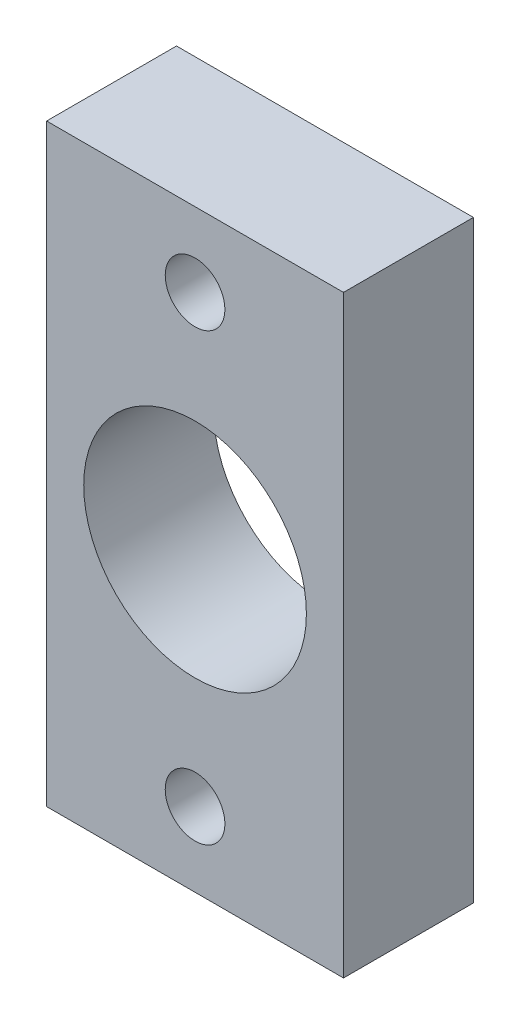
ISO-10303-21;
HEADER;
FILE_DESCRIPTION(('STEP AP214'),'2;1');
FILE_NAME('part.step','',(''),(''),'','','');
FILE_SCHEMA(('AUTOMOTIVE_DESIGN { 1 0 10303 214 1 1 1 1 }'));
ENDSEC;
DATA;
#1=APPLICATION_CONTEXT('core data for automotive mechanical design processes');
#2=APPLICATION_PROTOCOL_DEFINITION('international standard','automotive_design',2000,#1);
#3=PRODUCT_CONTEXT('',#1,'mechanical');
#4=PRODUCT('Part','Part','',(#3));
#5=PRODUCT_RELATED_PRODUCT_CATEGORY('part','',(#4));
#6=PRODUCT_DEFINITION_FORMATION('','',#4);
#7=PRODUCT_DEFINITION_CONTEXT('part definition',#1,'design');
#8=PRODUCT_DEFINITION('design','',#6,#7);
#9=PRODUCT_DEFINITION_SHAPE('','',#8);
#10=(LENGTH_UNIT() NAMED_UNIT(*) SI_UNIT(.MILLI.,.METRE.));
#11=(NAMED_UNIT(*) PLANE_ANGLE_UNIT() SI_UNIT($,.RADIAN.));
#12=(NAMED_UNIT(*) SI_UNIT($,.STERADIAN.) SOLID_ANGLE_UNIT());
#13=UNCERTAINTY_MEASURE_WITH_UNIT(LENGTH_MEASURE(1.E-05),#10,'distance_accuracy_value','');
#14=(GEOMETRIC_REPRESENTATION_CONTEXT(3) GLOBAL_UNCERTAINTY_ASSIGNED_CONTEXT((#13)) GLOBAL_UNIT_ASSIGNED_CONTEXT((#10,
#11,#12)) REPRESENTATION_CONTEXT('',''));
#15=CARTESIAN_POINT('',(0.,0.,0.));
#16=DIRECTION('',(0.,0.,1.));
#17=DIRECTION('',(1.,0.,0.));
#18=AXIS2_PLACEMENT_3D('',#15,#16,#17);
#19=CARTESIAN_POINT('',(0.,0.,-0.555625));
#20=DIRECTION('',(0.,0.,-1.));
#21=DIRECTION('',(1.,0.,0.));
#22=AXIS2_PLACEMENT_3D('',#19,#20,#21);
#23=CYLINDRICAL_SURFACE('',#22,9.525);
#24=CARTESIAN_POINT('',(0.,0.,5.55625));
#25=DIRECTION('',(0.,0.,-1.));
#26=DIRECTION('',(1.,0.,0.));
#27=AXIS2_PLACEMENT_3D('',#24,#25,#26);
#28=CIRCLE('',#27,9.525);
#29=CARTESIAN_POINT('',(9.525,0.,5.55625));
#30=VERTEX_POINT('',#29);
#31=CARTESIAN_POINT('',(-9.525,0.,5.55625));
#32=VERTEX_POINT('',#31);
#33=EDGE_CURVE('E39',#30,#32,#28,.T.);
#34=ORIENTED_EDGE('',*,*,#33,.F.);
#35=CARTESIAN_POINT('',(0.,0.,5.55625));
#36=DIRECTION('',(0.,0.,-1.));
#37=DIRECTION('',(1.,0.,0.));
#38=AXIS2_PLACEMENT_3D('',#35,#36,#37);
#39=CIRCLE('',#38,9.525);
#40=EDGE_CURVE('E44',#32,#30,#39,.T.);
#41=ORIENTED_EDGE('',*,*,#40,.F.);
#42=DIRECTION('',(0.,0.,-1.));
#43=VECTOR('',#42,1.);
#44=CARTESIAN_POINT('',(-9.525,0.,-0.555625));
#45=LINE('',#44,#43);
#46=CARTESIAN_POINT('',(-9.525,0.,-5.55625));
#47=VERTEX_POINT('',#46);
#48=EDGE_CURVE('E11',#32,#47,#45,.T.);
#49=ORIENTED_EDGE('',*,*,#48,.T.);
#50=CARTESIAN_POINT('',(0.,0.,-5.55625));
#51=DIRECTION('',(0.,0.,1.));
#52=DIRECTION('',(1.,0.,0.));
#53=AXIS2_PLACEMENT_3D('',#50,#51,#52);
#54=CIRCLE('',#53,9.525);
#55=EDGE_CURVE('E119',#47,#47,#54,.T.);
#56=ORIENTED_EDGE('',*,*,#55,.F.);
#57=ORIENTED_EDGE('',*,*,#48,.F.);
#58=EDGE_LOOP('',(#34,#41,#49,#56,#57));
#59=FACE_BOUND('',#58,.T.);
#60=ADVANCED_FACE('F16',(#59),#23,.F.);
#61=CARTESIAN_POINT('',(0.,-19.05,-0.555625));
#62=DIRECTION('',(0.,0.,-1.));
#63=DIRECTION('',(1.,0.,0.));
#64=AXIS2_PLACEMENT_3D('',#61,#62,#63);
#65=CYLINDRICAL_SURFACE('',#64,2.5525);
#66=CARTESIAN_POINT('',(0.,-19.05,5.55625));
#67=DIRECTION('',(0.,0.,-1.));
#68=DIRECTION('',(1.,0.,0.));
#69=AXIS2_PLACEMENT_3D('',#66,#67,#68);
#70=CIRCLE('',#69,2.5525);
#71=CARTESIAN_POINT('',(2.5525,-19.05,5.55625));
#72=VERTEX_POINT('',#71);
#73=CARTESIAN_POINT('',(-2.5525,-19.05,5.55625));
#74=VERTEX_POINT('',#73);
#75=EDGE_CURVE('E173',#72,#74,#70,.T.);
#76=ORIENTED_EDGE('',*,*,#75,.F.);
#77=CARTESIAN_POINT('',(0.,-19.05,5.55625));
#78=DIRECTION('',(0.,0.,-1.));
#79=DIRECTION('',(1.,0.,0.));
#80=AXIS2_PLACEMENT_3D('',#77,#78,#79);
#81=CIRCLE('',#80,2.5525);
#82=EDGE_CURVE('E167',#74,#72,#81,.T.);
#83=ORIENTED_EDGE('',*,*,#82,.F.);
#84=DIRECTION('',(0.,0.,-1.));
#85=VECTOR('',#84,1.);
#86=CARTESIAN_POINT('',(-2.5525,-19.05,-0.555625));
#87=LINE('',#86,#85);
#88=CARTESIAN_POINT('',(-2.5525,-19.05,-5.55625));
#89=VERTEX_POINT('',#88);
#90=EDGE_CURVE('E26',#74,#89,#87,.T.);
#91=ORIENTED_EDGE('',*,*,#90,.T.);
#92=CARTESIAN_POINT('',(0.,-19.05,-5.55625));
#93=DIRECTION('',(0.,0.,1.));
#94=DIRECTION('',(1.,0.,0.));
#95=AXIS2_PLACEMENT_3D('',#92,#93,#94);
#96=CIRCLE('',#95,2.5525);
#97=EDGE_CURVE('E153',#89,#89,#96,.T.);
#98=ORIENTED_EDGE('',*,*,#97,.F.);
#99=ORIENTED_EDGE('',*,*,#90,.F.);
#100=EDGE_LOOP('',(#76,#83,#91,#98,#99));
#101=FACE_BOUND('',#100,.T.);
#102=ADVANCED_FACE('F205',(#101),#65,.F.);
#103=CARTESIAN_POINT('',(0.,19.05,-0.555625));
#104=DIRECTION('',(0.,0.,-1.));
#105=DIRECTION('',(1.,0.,0.));
#106=AXIS2_PLACEMENT_3D('',#103,#104,#105);
#107=CYLINDRICAL_SURFACE('',#106,2.5525);
#108=CARTESIAN_POINT('',(0.,19.05,5.55625));
#109=DIRECTION('',(0.,0.,-1.));
#110=DIRECTION('',(1.,0.,0.));
#111=AXIS2_PLACEMENT_3D('',#108,#109,#110);
#112=CIRCLE('',#111,2.5525);
#113=CARTESIAN_POINT('',(2.5525,19.05,5.55625));
#114=VERTEX_POINT('',#113);
#115=CARTESIAN_POINT('',(-2.5525,19.05,5.55625));
#116=VERTEX_POINT('',#115);
#117=EDGE_CURVE('E142',#114,#116,#112,.T.);
#118=ORIENTED_EDGE('',*,*,#117,.F.);
#119=CARTESIAN_POINT('',(0.,19.05,5.55625));
#120=DIRECTION('',(0.,0.,-1.));
#121=DIRECTION('',(1.,0.,0.));
#122=AXIS2_PLACEMENT_3D('',#119,#120,#121);
#123=CIRCLE('',#122,2.5525);
#124=EDGE_CURVE('E136',#116,#114,#123,.T.);
#125=ORIENTED_EDGE('',*,*,#124,.F.);
#126=DIRECTION('',(0.,0.,-1.));
#127=VECTOR('',#126,1.);
#128=CARTESIAN_POINT('',(-2.5525,19.05,-0.555625));
#129=LINE('',#128,#127);
#130=CARTESIAN_POINT('',(-2.5525,19.05,-5.55625));
#131=VERTEX_POINT('',#130);
#132=EDGE_CURVE('E128',#116,#131,#129,.T.);
#133=ORIENTED_EDGE('',*,*,#132,.T.);
#134=CARTESIAN_POINT('',(0.,19.05,-5.55625));
#135=DIRECTION('',(0.,0.,1.));
#136=DIRECTION('',(1.,0.,0.));
#137=AXIS2_PLACEMENT_3D('',#134,#135,#136);
#138=CIRCLE('',#137,2.5525);
#139=EDGE_CURVE('E150',#131,#131,#138,.T.);
#140=ORIENTED_EDGE('',*,*,#139,.F.);
#141=ORIENTED_EDGE('',*,*,#132,.F.);
#142=EDGE_LOOP('',(#118,#125,#133,#140,#141));
#143=FACE_BOUND('',#142,.T.);
#144=ADVANCED_FACE('F215',(#143),#107,.F.);
#145=CARTESIAN_POINT('',(0.,-25.4,0.));
#146=DIRECTION('',(0.,-1.,0.));
#147=DIRECTION('',(0.,0.,-1.));
#148=AXIS2_PLACEMENT_3D('',#145,#146,#147);
#149=PLANE('',#148);
#150=DIRECTION('',(0.,0.,-1.));
#151=VECTOR('',#150,1.);
#152=CARTESIAN_POINT('',(-12.7,-25.4,-5.55625));
#153=LINE('',#152,#151);
#154=CARTESIAN_POINT('',(-12.7,-25.4,5.55625));
#155=VERTEX_POINT('',#154);
#156=CARTESIAN_POINT('',(-12.7,-25.4,-5.55625));
#157=VERTEX_POINT('',#156);
#158=EDGE_CURVE('E111',#155,#157,#153,.T.);
#159=ORIENTED_EDGE('',*,*,#158,.T.);
#160=DIRECTION('',(1.,0.,0.));
#161=VECTOR('',#160,1.);
#162=CARTESIAN_POINT('',(12.7,-25.4,-5.55625));
#163=LINE('',#162,#161);
#164=CARTESIAN_POINT('',(12.7,-25.4,-5.55625));
#165=VERTEX_POINT('',#164);
#166=EDGE_CURVE('E129',#157,#165,#163,.T.);
#167=ORIENTED_EDGE('',*,*,#166,.T.);
#168=DIRECTION('',(0.,0.,1.));
#169=VECTOR('',#168,1.);
#170=CARTESIAN_POINT('',(12.7,-25.4,5.55625));
#171=LINE('',#170,#169);
#172=CARTESIAN_POINT('',(12.7,-25.4,5.55625));
#173=VERTEX_POINT('',#172);
#174=EDGE_CURVE('E113',#165,#173,#171,.T.);
#175=ORIENTED_EDGE('',*,*,#174,.T.);
#176=DIRECTION('',(-1.,0.,0.));
#177=VECTOR('',#176,1.);
#178=CARTESIAN_POINT('',(-12.7,-25.4,5.55625));
#179=LINE('',#178,#177);
#180=EDGE_CURVE('E107',#173,#155,#179,.T.);
#181=ORIENTED_EDGE('',*,*,#180,.T.);
#182=EDGE_LOOP('',(#159,#167,#175,#181));
#183=FACE_BOUND('',#182,.T.);
#184=ADVANCED_FACE('F109',(#183),#149,.T.);
#185=CARTESIAN_POINT('',(12.7,0.,-5.55625));
#186=DIRECTION('',(0.,0.,-1.));
#187=DIRECTION('',(0.,-1.,0.));
#188=AXIS2_PLACEMENT_3D('',#185,#186,#187);
#189=PLANE('',#188);
#190=DIRECTION('',(0.,-1.,0.));
#191=VECTOR('',#190,1.);
#192=CARTESIAN_POINT('',(-12.7,0.,-5.55625));
#193=LINE('',#192,#191);
#194=CARTESIAN_POINT('',(-12.7,25.4,-5.55625));
#195=VERTEX_POINT('',#194);
#196=EDGE_CURVE('E126',#195,#157,#193,.T.);
#197=ORIENTED_EDGE('',*,*,#196,.F.);
#198=DIRECTION('',(-1.,0.,0.));
#199=VECTOR('',#198,1.);
#200=CARTESIAN_POINT('',(12.7,25.4,-5.55625));
#201=LINE('',#200,#199);
#202=CARTESIAN_POINT('',(12.7,25.4,-5.55625));
#203=VERTEX_POINT('',#202);
#204=EDGE_CURVE('E160',#203,#195,#201,.T.);
#205=ORIENTED_EDGE('',*,*,#204,.F.);
#206=DIRECTION('',(0.,1.,0.));
#207=VECTOR('',#206,1.);
#208=CARTESIAN_POINT('',(12.7,0.,-5.55625));
#209=LINE('',#208,#207);
#210=EDGE_CURVE('E154',#165,#203,#209,.T.);
#211=ORIENTED_EDGE('',*,*,#210,.F.);
#212=ORIENTED_EDGE('',*,*,#166,.F.);
#213=EDGE_LOOP('',(#197,#205,#211,#212));
#214=FACE_BOUND('',#213,.T.);
#215=ORIENTED_EDGE('',*,*,#55,.T.);
#216=EDGE_LOOP('',(#215));
#217=FACE_BOUND('',#216,.T.);
#218=ORIENTED_EDGE('',*,*,#97,.T.);
#219=EDGE_LOOP('',(#218));
#220=FACE_BOUND('',#219,.T.);
#221=ORIENTED_EDGE('',*,*,#139,.T.);
#222=EDGE_LOOP('',(#221));
#223=FACE_BOUND('',#222,.T.);
#224=ADVANCED_FACE('F207',(#214,#217,#220,#223),#189,.T.);
#225=CARTESIAN_POINT('',(12.7,0.,5.55625));
#226=DIRECTION('',(1.,0.,0.));
#227=DIRECTION('',(0.,1.,0.));
#228=AXIS2_PLACEMENT_3D('',#225,#226,#227);
#229=PLANE('',#228);
#230=ORIENTED_EDGE('',*,*,#210,.T.);
#231=DIRECTION('',(0.,0.,-1.));
#232=VECTOR('',#231,1.);
#233=CARTESIAN_POINT('',(12.7,25.4,5.55625));
#234=LINE('',#233,#232);
#235=CARTESIAN_POINT('',(12.7,25.4,5.55625));
#236=VERTEX_POINT('',#235);
#237=EDGE_CURVE('E163',#236,#203,#234,.T.);
#238=ORIENTED_EDGE('',*,*,#237,.F.);
#239=DIRECTION('',(0.,1.,0.));
#240=VECTOR('',#239,1.);
#241=CARTESIAN_POINT('',(12.7,0.,5.55625));
#242=LINE('',#241,#240);
#243=EDGE_CURVE('E174',#173,#236,#242,.T.);
#244=ORIENTED_EDGE('',*,*,#243,.F.);
#245=ORIENTED_EDGE('',*,*,#174,.F.);
#246=EDGE_LOOP('',(#230,#238,#244,#245));
#247=FACE_BOUND('',#246,.T.);
#248=ADVANCED_FACE('F210',(#247),#229,.T.);
#249=CARTESIAN_POINT('',(-12.7,0.,5.55625));
#250=DIRECTION('',(0.,0.,1.));
#251=DIRECTION('',(1.,0.,0.));
#252=AXIS2_PLACEMENT_3D('',#249,#250,#251);
#253=PLANE('',#252);
#254=ORIENTED_EDGE('',*,*,#243,.T.);
#255=DIRECTION('',(1.,0.,0.));
#256=VECTOR('',#255,1.);
#257=CARTESIAN_POINT('',(-12.7,25.4,5.55625));
#258=LINE('',#257,#256);
#259=CARTESIAN_POINT('',(-12.7,25.4,5.55625));
#260=VERTEX_POINT('',#259);
#261=EDGE_CURVE('E134',#260,#236,#258,.T.);
#262=ORIENTED_EDGE('',*,*,#261,.F.);
#263=DIRECTION('',(0.,1.,0.));
#264=VECTOR('',#263,1.);
#265=CARTESIAN_POINT('',(-12.7,0.,5.55625));
#266=LINE('',#265,#264);
#267=EDGE_CURVE('E20',#155,#260,#266,.T.);
#268=ORIENTED_EDGE('',*,*,#267,.F.);
#269=ORIENTED_EDGE('',*,*,#180,.F.);
#270=EDGE_LOOP('',(#254,#262,#268,#269));
#271=FACE_BOUND('',#270,.T.);
#272=ORIENTED_EDGE('',*,*,#33,.T.);
#273=ORIENTED_EDGE('',*,*,#40,.T.);
#274=EDGE_LOOP('',(#272,#273));
#275=FACE_BOUND('',#274,.T.);
#276=ORIENTED_EDGE('',*,*,#75,.T.);
#277=ORIENTED_EDGE('',*,*,#82,.T.);
#278=EDGE_LOOP('',(#276,#277));
#279=FACE_BOUND('',#278,.T.);
#280=ORIENTED_EDGE('',*,*,#117,.T.);
#281=ORIENTED_EDGE('',*,*,#124,.T.);
#282=EDGE_LOOP('',(#280,#281));
#283=FACE_BOUND('',#282,.T.);
#284=ADVANCED_FACE('F131',(#271,#275,#279,#283),#253,.T.);
#285=CARTESIAN_POINT('',(-12.7,0.,-5.55625));
#286=DIRECTION('',(-1.,0.,0.));
#287=DIRECTION('',(0.,0.,1.));
#288=AXIS2_PLACEMENT_3D('',#285,#286,#287);
#289=PLANE('',#288);
#290=ORIENTED_EDGE('',*,*,#267,.T.);
#291=DIRECTION('',(0.,0.,1.));
#292=VECTOR('',#291,1.);
#293=CARTESIAN_POINT('',(-12.7,25.4,-5.55625));
#294=LINE('',#293,#292);
#295=EDGE_CURVE('E144',#195,#260,#294,.T.);
#296=ORIENTED_EDGE('',*,*,#295,.F.);
#297=ORIENTED_EDGE('',*,*,#196,.T.);
#298=ORIENTED_EDGE('',*,*,#158,.F.);
#299=EDGE_LOOP('',(#290,#296,#297,#298));
#300=FACE_BOUND('',#299,.T.);
#301=ADVANCED_FACE('F18',(#300),#289,.T.);
#302=CARTESIAN_POINT('',(0.,25.4,0.));
#303=DIRECTION('',(0.,1.,0.));
#304=DIRECTION('',(1.,0.,0.));
#305=AXIS2_PLACEMENT_3D('',#302,#303,#304);
#306=PLANE('',#305);
#307=ORIENTED_EDGE('',*,*,#295,.T.);
#308=ORIENTED_EDGE('',*,*,#261,.T.);
#309=ORIENTED_EDGE('',*,*,#237,.T.);
#310=ORIENTED_EDGE('',*,*,#204,.T.);
#311=EDGE_LOOP('',(#307,#308,#309,#310));
#312=FACE_BOUND('',#311,.T.);
#313=ADVANCED_FACE('F222',(#312),#306,.T.);
#314=CLOSED_SHELL('',(#60,#102,#144,#184,#224,#248,#284,#301,#313));
#315=MANIFOLD_SOLID_BREP('B1',#314);
#316=ADVANCED_BREP_SHAPE_REPRESENTATION('',(#18,#315),#14);
#317=SHAPE_DEFINITION_REPRESENTATION(#9,#316);
ENDSEC;
END-ISO-10303-21;
